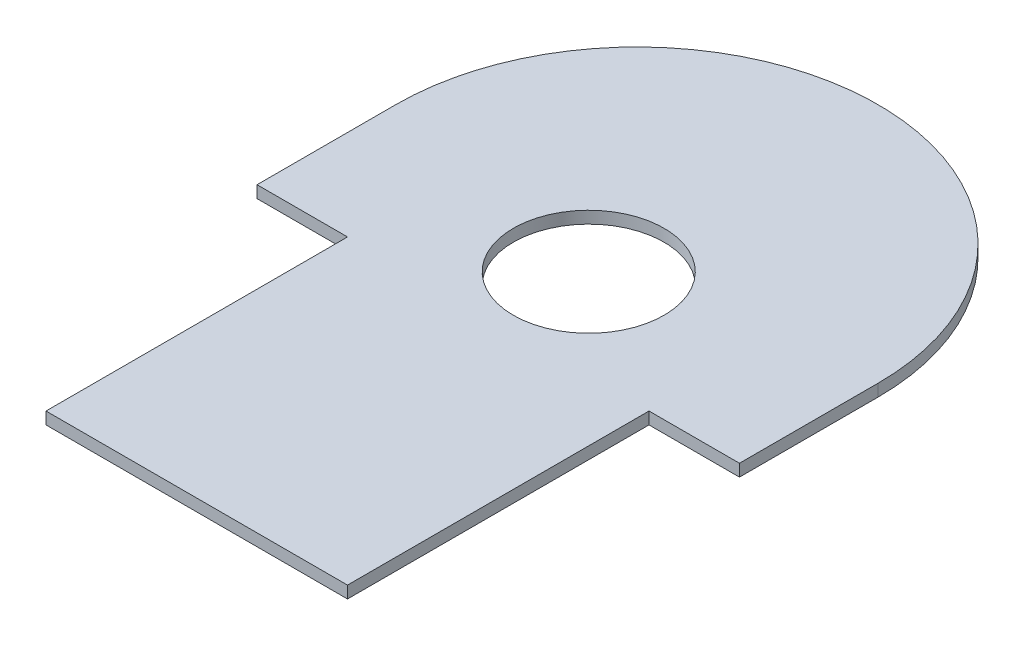
ISO-10303-21;
HEADER;
FILE_DESCRIPTION(('STEP AP214'),'2;1');
FILE_NAME('part.step','',(''),(''),'','','');
FILE_SCHEMA(('AUTOMOTIVE_DESIGN { 1 0 10303 214 1 1 1 1 }'));
ENDSEC;
DATA;
#1=APPLICATION_CONTEXT('core data for automotive mechanical design processes');
#2=APPLICATION_PROTOCOL_DEFINITION('international standard','automotive_design',2000,#1);
#3=PRODUCT_CONTEXT('',#1,'mechanical');
#4=PRODUCT('Part','Part','',(#3));
#5=PRODUCT_RELATED_PRODUCT_CATEGORY('part','',(#4));
#6=PRODUCT_DEFINITION_FORMATION('','',#4);
#7=PRODUCT_DEFINITION_CONTEXT('part definition',#1,'design');
#8=PRODUCT_DEFINITION('design','',#6,#7);
#9=PRODUCT_DEFINITION_SHAPE('','',#8);
#10=(LENGTH_UNIT() NAMED_UNIT(*) SI_UNIT(.MILLI.,.METRE.));
#11=(NAMED_UNIT(*) PLANE_ANGLE_UNIT() SI_UNIT($,.RADIAN.));
#12=(NAMED_UNIT(*) SI_UNIT($,.STERADIAN.) SOLID_ANGLE_UNIT());
#13=UNCERTAINTY_MEASURE_WITH_UNIT(LENGTH_MEASURE(1.E-05),#10,'distance_accuracy_value','');
#14=(GEOMETRIC_REPRESENTATION_CONTEXT(3) GLOBAL_UNCERTAINTY_ASSIGNED_CONTEXT((#13)) GLOBAL_UNIT_ASSIGNED_CONTEXT((#10,
#11,#12)) REPRESENTATION_CONTEXT('',''));
#15=CARTESIAN_POINT('',(0.,0.,0.));
#16=DIRECTION('',(0.,0.,1.));
#17=DIRECTION('',(1.,0.,0.));
#18=AXIS2_PLACEMENT_3D('',#15,#16,#17);
#19=CARTESIAN_POINT('',(-50.1548672566371,2.,-35.6106194690266));
#20=DIRECTION('',(0.,-1.,0.));
#21=DIRECTION('',(0.,0.,-1.));
#22=AXIS2_PLACEMENT_3D('',#19,#20,#21);
#23=CYLINDRICAL_SURFACE('',#22,40.);
#24=CARTESIAN_POINT('',(-50.1548672566371,0.,-35.6106194690266));
#25=DIRECTION('',(0.,1.,0.));
#26=DIRECTION('',(0.,0.,1.));
#27=AXIS2_PLACEMENT_3D('',#24,#25,#26);
#28=CIRCLE('',#27,40.);
#29=CARTESIAN_POINT('',(-10.1548672566371,0.,-35.6106194690266));
#30=VERTEX_POINT('',#29);
#31=CARTESIAN_POINT('',(-90.1548672566371,0.,-35.6106194690265));
#32=VERTEX_POINT('',#31);
#33=EDGE_CURVE('E135',#30,#32,#28,.T.);
#34=ORIENTED_EDGE('',*,*,#33,.T.);
#35=DIRECTION('',(0.,-1.,0.));
#36=VECTOR('',#35,1.);
#37=CARTESIAN_POINT('',(-90.1548672566371,2.,-35.6106194690265));
#38=LINE('',#37,#36);
#39=CARTESIAN_POINT('',(-90.1548672566371,2.,-35.6106194690265));
#40=VERTEX_POINT('',#39);
#41=EDGE_CURVE('E11',#40,#32,#38,.T.);
#42=ORIENTED_EDGE('',*,*,#41,.F.);
#43=CARTESIAN_POINT('',(-50.1548672566371,2.,-35.6106194690266));
#44=DIRECTION('',(0.,1.,0.));
#45=DIRECTION('',(0.,0.,1.));
#46=AXIS2_PLACEMENT_3D('',#43,#44,#45);
#47=CIRCLE('',#46,40.);
#48=CARTESIAN_POINT('',(-10.1548672566371,2.,-35.6106194690266));
#49=VERTEX_POINT('',#48);
#50=EDGE_CURVE('E123',#49,#40,#47,.T.);
#51=ORIENTED_EDGE('',*,*,#50,.F.);
#52=DIRECTION('',(0.,-1.,0.));
#53=VECTOR('',#52,1.);
#54=CARTESIAN_POINT('',(-10.1548672566371,2.,-35.6106194690266));
#55=LINE('',#54,#53);
#56=EDGE_CURVE('E46',#49,#30,#55,.T.);
#57=ORIENTED_EDGE('',*,*,#56,.T.);
#58=EDGE_LOOP('',(#34,#42,#51,#57));
#59=FACE_BOUND('',#58,.T.);
#60=ADVANCED_FACE('F39',(#59),#23,.T.);
#61=CARTESIAN_POINT('',(-90.1548672566371,2.,-35.6106194690265));
#62=DIRECTION('',(1.,0.,0.));
#63=DIRECTION('',(0.,0.,-1.));
#64=AXIS2_PLACEMENT_3D('',#61,#62,#63);
#65=PLANE('',#64);
#66=DIRECTION('',(0.,0.,1.));
#67=VECTOR('',#66,1.);
#68=CARTESIAN_POINT('',(-90.1548672566371,0.,-35.6106194690265));
#69=LINE('',#68,#67);
#70=CARTESIAN_POINT('',(-90.1548672566371,0.,-12.6106194690266));
#71=VERTEX_POINT('',#70);
#72=EDGE_CURVE('E118',#32,#71,#69,.T.);
#73=ORIENTED_EDGE('',*,*,#72,.T.);
#74=DIRECTION('',(0.,1.,0.));
#75=VECTOR('',#74,1.);
#76=CARTESIAN_POINT('',(-90.1548672566371,0.,-12.6106194690266));
#77=LINE('',#76,#75);
#78=CARTESIAN_POINT('',(-90.1548672566371,2.,-12.6106194690266));
#79=VERTEX_POINT('',#78);
#80=EDGE_CURVE('E104',#71,#79,#77,.T.);
#81=ORIENTED_EDGE('',*,*,#80,.T.);
#82=DIRECTION('',(0.,0.,1.));
#83=VECTOR('',#82,1.);
#84=CARTESIAN_POINT('',(-90.1548672566371,2.,-35.6106194690265));
#85=LINE('',#84,#83);
#86=EDGE_CURVE('E116',#40,#79,#85,.T.);
#87=ORIENTED_EDGE('',*,*,#86,.F.);
#88=ORIENTED_EDGE('',*,*,#41,.T.);
#89=EDGE_LOOP('',(#73,#81,#87,#88));
#90=FACE_BOUND('',#89,.T.);
#91=ADVANCED_FACE('F115',(#90),#65,.F.);
#92=CARTESIAN_POINT('',(-90.1548672566371,2.,37.3893805309735));
#93=DIRECTION('',(0.,0.,-1.));
#94=DIRECTION('',(-1.,0.,0.));
#95=AXIS2_PLACEMENT_3D('',#92,#93,#94);
#96=PLANE('',#95);
#97=DIRECTION('',(1.,0.,0.));
#98=VECTOR('',#97,1.);
#99=CARTESIAN_POINT('',(-90.1548672566371,2.,37.3893805309735));
#100=LINE('',#99,#98);
#101=CARTESIAN_POINT('',(-75.1548672566371,2.,37.3893805309735));
#102=VERTEX_POINT('',#101);
#103=CARTESIAN_POINT('',(-25.1548672566371,2.,37.3893805309735));
#104=VERTEX_POINT('',#103);
#105=EDGE_CURVE('E125',#102,#104,#100,.T.);
#106=ORIENTED_EDGE('',*,*,#105,.F.);
#107=DIRECTION('',(0.,1.,0.));
#108=VECTOR('',#107,1.);
#109=CARTESIAN_POINT('',(-75.1548672566371,0.,37.3893805309735));
#110=LINE('',#109,#108);
#111=CARTESIAN_POINT('',(-75.1548672566371,0.,37.3893805309735));
#112=VERTEX_POINT('',#111);
#113=EDGE_CURVE('E155',#112,#102,#110,.T.);
#114=ORIENTED_EDGE('',*,*,#113,.F.);
#115=DIRECTION('',(1.,0.,0.));
#116=VECTOR('',#115,1.);
#117=CARTESIAN_POINT('',(-90.1548672566371,0.,37.3893805309735));
#118=LINE('',#117,#116);
#119=CARTESIAN_POINT('',(-25.1548672566371,0.,37.3893805309735));
#120=VERTEX_POINT('',#119);
#121=EDGE_CURVE('E140',#112,#120,#118,.T.);
#122=ORIENTED_EDGE('',*,*,#121,.T.);
#123=DIRECTION('',(0.,1.,0.));
#124=VECTOR('',#123,1.);
#125=CARTESIAN_POINT('',(-25.1548672566371,0.,37.3893805309735));
#126=LINE('',#125,#124);
#127=EDGE_CURVE('E165',#120,#104,#126,.T.);
#128=ORIENTED_EDGE('',*,*,#127,.T.);
#129=EDGE_LOOP('',(#106,#114,#122,#128));
#130=FACE_BOUND('',#129,.T.);
#131=ADVANCED_FACE('F182',(#130),#96,.F.);
#132=CARTESIAN_POINT('',(-10.1548672566371,2.,37.3893805309735));
#133=DIRECTION('',(-1.,0.,0.));
#134=DIRECTION('',(0.,0.,1.));
#135=AXIS2_PLACEMENT_3D('',#132,#133,#134);
#136=PLANE('',#135);
#137=DIRECTION('',(0.,0.,-1.));
#138=VECTOR('',#137,1.);
#139=CARTESIAN_POINT('',(-10.1548672566371,2.,37.3893805309735));
#140=LINE('',#139,#138);
#141=CARTESIAN_POINT('',(-10.1548672566371,2.,-12.6106194690266));
#142=VERTEX_POINT('',#141);
#143=EDGE_CURVE('E128',#142,#49,#140,.T.);
#144=ORIENTED_EDGE('',*,*,#143,.F.);
#145=DIRECTION('',(0.,1.,0.));
#146=VECTOR('',#145,1.);
#147=CARTESIAN_POINT('',(-10.1548672566371,0.,-12.6106194690266));
#148=LINE('',#147,#146);
#149=CARTESIAN_POINT('',(-10.1548672566371,0.,-12.6106194690266));
#150=VERTEX_POINT('',#149);
#151=EDGE_CURVE('E161',#150,#142,#148,.T.);
#152=ORIENTED_EDGE('',*,*,#151,.F.);
#153=DIRECTION('',(0.,0.,-1.));
#154=VECTOR('',#153,1.);
#155=CARTESIAN_POINT('',(-10.1548672566371,0.,37.3893805309735));
#156=LINE('',#155,#154);
#157=EDGE_CURVE('E130',#150,#30,#156,.T.);
#158=ORIENTED_EDGE('',*,*,#157,.T.);
#159=ORIENTED_EDGE('',*,*,#56,.F.);
#160=EDGE_LOOP('',(#144,#152,#158,#159));
#161=FACE_BOUND('',#160,.T.);
#162=ADVANCED_FACE('F177',(#161),#136,.F.);
#163=CARTESIAN_POINT('',(-50.1548672566371,2.,-35.6106194690266));
#164=DIRECTION('',(0.,1.,0.));
#165=DIRECTION('',(0.,0.,1.));
#166=AXIS2_PLACEMENT_3D('',#163,#164,#165);
#167=PLANE('',#166);
#168=CARTESIAN_POINT('',(-50.1548672566371,2.,-27.6106194690266));
#169=DIRECTION('',(0.,1.,0.));
#170=DIRECTION('',(0.,0.,1.));
#171=AXIS2_PLACEMENT_3D('',#168,#169,#170);
#172=CIRCLE('',#171,12.5);
#173=CARTESIAN_POINT('',(-50.1548672566371,2.,-15.1106194690266));
#174=VERTEX_POINT('',#173);
#175=EDGE_CURVE('E186',#174,#174,#172,.T.);
#176=ORIENTED_EDGE('',*,*,#175,.F.);
#177=EDGE_LOOP('',(#176));
#178=FACE_BOUND('',#177,.T.);
#179=DIRECTION('',(-1.,0.,0.));
#180=VECTOR('',#179,1.);
#181=CARTESIAN_POINT('',(-90.1548672566371,2.,-12.6106194690266));
#182=LINE('',#181,#180);
#183=CARTESIAN_POINT('',(-75.1548672566371,2.,-12.6106194690266));
#184=VERTEX_POINT('',#183);
#185=EDGE_CURVE('E101',#184,#79,#182,.T.);
#186=ORIENTED_EDGE('',*,*,#185,.F.);
#187=DIRECTION('',(0.,0.,-1.));
#188=VECTOR('',#187,1.);
#189=CARTESIAN_POINT('',(-75.1548672566371,2.,37.3893805309735));
#190=LINE('',#189,#188);
#191=EDGE_CURVE('E110',#102,#184,#190,.T.);
#192=ORIENTED_EDGE('',*,*,#191,.F.);
#193=ORIENTED_EDGE('',*,*,#105,.T.);
#194=DIRECTION('',(0.,0.,1.));
#195=VECTOR('',#194,1.);
#196=CARTESIAN_POINT('',(-25.1548672566371,2.,37.3893805309735));
#197=LINE('',#196,#195);
#198=CARTESIAN_POINT('',(-25.1548672566371,2.,-12.6106194690265));
#199=VERTEX_POINT('',#198);
#200=EDGE_CURVE('E168',#199,#104,#197,.T.);
#201=ORIENTED_EDGE('',*,*,#200,.F.);
#202=DIRECTION('',(-1.,0.,0.));
#203=VECTOR('',#202,1.);
#204=CARTESIAN_POINT('',(-10.1548672566371,2.,-12.6106194690266));
#205=LINE('',#204,#203);
#206=EDGE_CURVE('E119',#142,#199,#205,.T.);
#207=ORIENTED_EDGE('',*,*,#206,.F.);
#208=ORIENTED_EDGE('',*,*,#143,.T.);
#209=ORIENTED_EDGE('',*,*,#50,.T.);
#210=ORIENTED_EDGE('',*,*,#86,.T.);
#211=EDGE_LOOP('',(#186,#192,#193,#201,#207,#208,#209,#210));
#212=FACE_BOUND('',#211,.T.);
#213=ADVANCED_FACE('F121',(#178,#212),#167,.T.);
#214=CARTESIAN_POINT('',(-50.1548672566371,0.,-35.6106194690266));
#215=DIRECTION('',(0.,1.,0.));
#216=DIRECTION('',(0.,0.,1.));
#217=AXIS2_PLACEMENT_3D('',#214,#215,#216);
#218=PLANE('',#217);
#219=CARTESIAN_POINT('',(-50.1548672566371,0.,-27.6106194690266));
#220=DIRECTION('',(0.,1.,0.));
#221=DIRECTION('',(0.,0.,1.));
#222=AXIS2_PLACEMENT_3D('',#219,#220,#221);
#223=CIRCLE('',#222,12.5);
#224=CARTESIAN_POINT('',(-50.1548672566371,0.,-15.1106194690266));
#225=VERTEX_POINT('',#224);
#226=EDGE_CURVE('E138',#225,#225,#223,.T.);
#227=ORIENTED_EDGE('',*,*,#226,.T.);
#228=EDGE_LOOP('',(#227));
#229=FACE_BOUND('',#228,.T.);
#230=DIRECTION('',(0.,0.,-1.));
#231=VECTOR('',#230,1.);
#232=CARTESIAN_POINT('',(-75.1548672566371,0.,37.3893805309735));
#233=LINE('',#232,#231);
#234=CARTESIAN_POINT('',(-75.1548672566371,0.,-12.6106194690266));
#235=VERTEX_POINT('',#234);
#236=EDGE_CURVE('E111',#112,#235,#233,.T.);
#237=ORIENTED_EDGE('',*,*,#236,.T.);
#238=DIRECTION('',(-1.,0.,0.));
#239=VECTOR('',#238,1.);
#240=CARTESIAN_POINT('',(-90.1548672566371,0.,-12.6106194690266));
#241=LINE('',#240,#239);
#242=EDGE_CURVE('E53',#235,#71,#241,.T.);
#243=ORIENTED_EDGE('',*,*,#242,.T.);
#244=ORIENTED_EDGE('',*,*,#72,.F.);
#245=ORIENTED_EDGE('',*,*,#33,.F.);
#246=ORIENTED_EDGE('',*,*,#157,.F.);
#247=DIRECTION('',(-1.,0.,0.));
#248=VECTOR('',#247,1.);
#249=CARTESIAN_POINT('',(-10.1548672566371,0.,-12.6106194690266));
#250=LINE('',#249,#248);
#251=CARTESIAN_POINT('',(-25.1548672566371,0.,-12.6106194690265));
#252=VERTEX_POINT('',#251);
#253=EDGE_CURVE('E170',#150,#252,#250,.T.);
#254=ORIENTED_EDGE('',*,*,#253,.T.);
#255=DIRECTION('',(0.,0.,1.));
#256=VECTOR('',#255,1.);
#257=CARTESIAN_POINT('',(-25.1548672566371,0.,37.3893805309735));
#258=LINE('',#257,#256);
#259=EDGE_CURVE('E61',#252,#120,#258,.T.);
#260=ORIENTED_EDGE('',*,*,#259,.T.);
#261=ORIENTED_EDGE('',*,*,#121,.F.);
#262=EDGE_LOOP('',(#237,#243,#244,#245,#246,#254,#260,#261));
#263=FACE_BOUND('',#262,.T.);
#264=ADVANCED_FACE('F152',(#229,#263),#218,.F.);
#265=CARTESIAN_POINT('',(-25.1548672566371,0.,37.3893805309735));
#266=DIRECTION('',(-1.,0.,0.));
#267=DIRECTION('',(0.,0.,1.));
#268=AXIS2_PLACEMENT_3D('',#265,#266,#267);
#269=PLANE('',#268);
#270=ORIENTED_EDGE('',*,*,#200,.T.);
#271=ORIENTED_EDGE('',*,*,#127,.F.);
#272=ORIENTED_EDGE('',*,*,#259,.F.);
#273=DIRECTION('',(0.,1.,0.));
#274=VECTOR('',#273,1.);
#275=CARTESIAN_POINT('',(-25.1548672566371,0.,-12.6106194690265));
#276=LINE('',#275,#274);
#277=EDGE_CURVE('E163',#252,#199,#276,.T.);
#278=ORIENTED_EDGE('',*,*,#277,.T.);
#279=EDGE_LOOP('',(#270,#271,#272,#278));
#280=FACE_BOUND('',#279,.T.);
#281=ADVANCED_FACE('F180',(#280),#269,.F.);
#282=CARTESIAN_POINT('',(-10.1548672566371,0.,-12.6106194690266));
#283=DIRECTION('',(0.,0.,-1.));
#284=DIRECTION('',(-1.,0.,0.));
#285=AXIS2_PLACEMENT_3D('',#282,#283,#284);
#286=PLANE('',#285);
#287=ORIENTED_EDGE('',*,*,#206,.T.);
#288=ORIENTED_EDGE('',*,*,#277,.F.);
#289=ORIENTED_EDGE('',*,*,#253,.F.);
#290=ORIENTED_EDGE('',*,*,#151,.T.);
#291=EDGE_LOOP('',(#287,#288,#289,#290));
#292=FACE_BOUND('',#291,.T.);
#293=ADVANCED_FACE('F175',(#292),#286,.F.);
#294=CARTESIAN_POINT('',(-90.1548672566371,0.,-12.6106194690266));
#295=DIRECTION('',(0.,0.,-1.));
#296=DIRECTION('',(-1.,0.,0.));
#297=AXIS2_PLACEMENT_3D('',#294,#295,#296);
#298=PLANE('',#297);
#299=ORIENTED_EDGE('',*,*,#185,.T.);
#300=ORIENTED_EDGE('',*,*,#80,.F.);
#301=ORIENTED_EDGE('',*,*,#242,.F.);
#302=DIRECTION('',(0.,1.,0.));
#303=VECTOR('',#302,1.);
#304=CARTESIAN_POINT('',(-75.1548672566371,0.,-12.6106194690266));
#305=LINE('',#304,#303);
#306=EDGE_CURVE('E105',#235,#184,#305,.T.);
#307=ORIENTED_EDGE('',*,*,#306,.T.);
#308=EDGE_LOOP('',(#299,#300,#301,#307));
#309=FACE_BOUND('',#308,.T.);
#310=ADVANCED_FACE('F103',(#309),#298,.F.);
#311=CARTESIAN_POINT('',(-75.1548672566371,0.,37.3893805309735));
#312=DIRECTION('',(1.,0.,0.));
#313=DIRECTION('',(0.,0.,-1.));
#314=AXIS2_PLACEMENT_3D('',#311,#312,#313);
#315=PLANE('',#314);
#316=ORIENTED_EDGE('',*,*,#191,.T.);
#317=ORIENTED_EDGE('',*,*,#306,.F.);
#318=ORIENTED_EDGE('',*,*,#236,.F.);
#319=ORIENTED_EDGE('',*,*,#113,.T.);
#320=EDGE_LOOP('',(#316,#317,#318,#319));
#321=FACE_BOUND('',#320,.T.);
#322=ADVANCED_FACE('F185',(#321),#315,.F.);
#323=CARTESIAN_POINT('',(-50.1548672566371,0.,-27.6106194690266));
#324=DIRECTION('',(0.,1.,0.));
#325=DIRECTION('',(0.,0.,1.));
#326=AXIS2_PLACEMENT_3D('',#323,#324,#325);
#327=CYLINDRICAL_SURFACE('',#326,12.5);
#328=ORIENTED_EDGE('',*,*,#226,.F.);
#329=EDGE_LOOP('',(#328));
#330=FACE_BOUND('',#329,.T.);
#331=ORIENTED_EDGE('',*,*,#175,.T.);
#332=EDGE_LOOP('',(#331));
#333=FACE_BOUND('',#332,.T.);
#334=ADVANCED_FACE('F197',(#330,#333),#327,.F.);
#335=CLOSED_SHELL('',(#60,#91,#131,#162,#213,#264,#281,#293,#310,#322,#334));
#336=MANIFOLD_SOLID_BREP('B2',#335);
#337=ADVANCED_BREP_SHAPE_REPRESENTATION('',(#18,#336),#14);
#338=SHAPE_DEFINITION_REPRESENTATION(#9,#337);
ENDSEC;
END-ISO-10303-21;
